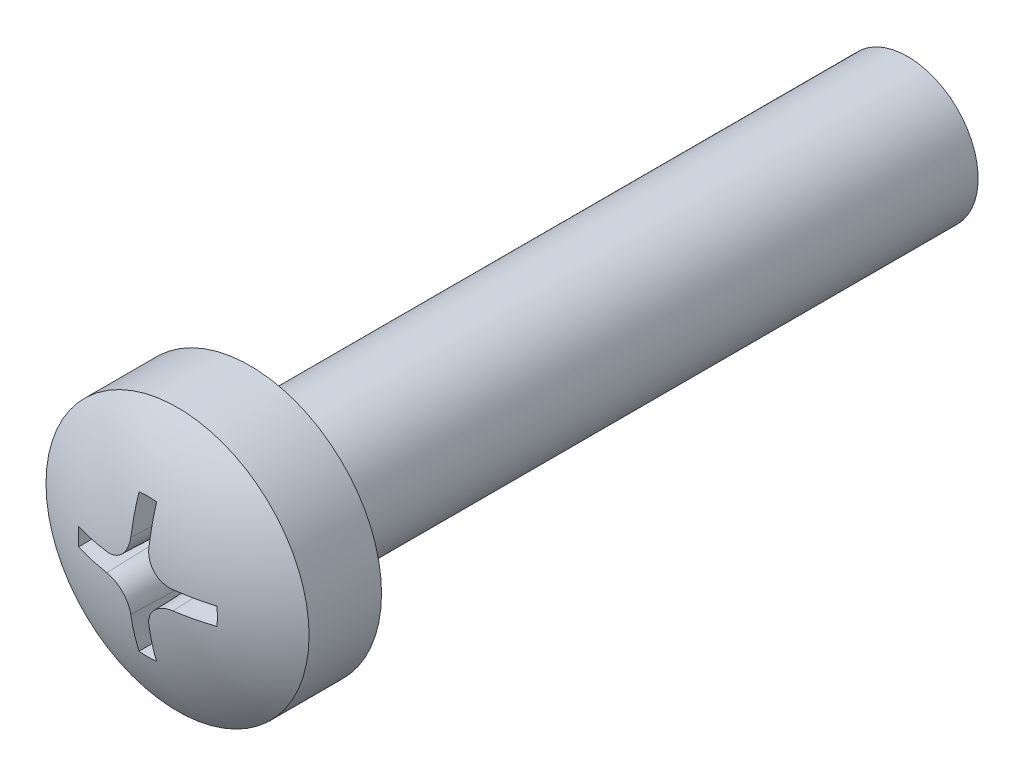
ISO-10303-21;
HEADER;
FILE_DESCRIPTION(('STEP AP214'),'2;1');
FILE_NAME('part.step','',(''),(''),'','','');
FILE_SCHEMA(('AUTOMOTIVE_DESIGN { 1 0 10303 214 1 1 1 1 }'));
ENDSEC;
DATA;
#1=APPLICATION_CONTEXT('core data for automotive mechanical design processes');
#2=APPLICATION_PROTOCOL_DEFINITION('international standard','automotive_design',2000,#1);
#3=PRODUCT_CONTEXT('',#1,'mechanical');
#4=PRODUCT('Part','Part','',(#3));
#5=PRODUCT_RELATED_PRODUCT_CATEGORY('part','',(#4));
#6=PRODUCT_DEFINITION_FORMATION('','',#4);
#7=PRODUCT_DEFINITION_CONTEXT('part definition',#1,'design');
#8=PRODUCT_DEFINITION('design','',#6,#7);
#9=PRODUCT_DEFINITION_SHAPE('','',#8);
#10=(LENGTH_UNIT() NAMED_UNIT(*) SI_UNIT(.MILLI.,.METRE.));
#11=(NAMED_UNIT(*) PLANE_ANGLE_UNIT() SI_UNIT($,.RADIAN.));
#12=(NAMED_UNIT(*) SI_UNIT($,.STERADIAN.) SOLID_ANGLE_UNIT());
#13=UNCERTAINTY_MEASURE_WITH_UNIT(LENGTH_MEASURE(1.E-05),#10,'distance_accuracy_value','');
#14=(GEOMETRIC_REPRESENTATION_CONTEXT(3) GLOBAL_UNCERTAINTY_ASSIGNED_CONTEXT((#13)) GLOBAL_UNIT_ASSIGNED_CONTEXT((#10,
#11,#12)) REPRESENTATION_CONTEXT('',''));
#15=CARTESIAN_POINT('',(0.,0.,0.));
#16=DIRECTION('',(0.,0.,1.));
#17=DIRECTION('',(1.,0.,0.));
#18=AXIS2_PLACEMENT_3D('',#15,#16,#17);
#19=CARTESIAN_POINT('',(0.,0.,14.9000001309199));
#20=DIRECTION('',(0.,0.,1.));
#21=DIRECTION('',(1.,0.,0.));
#22=AXIS2_PLACEMENT_3D('',#19,#20,#21);
#23=PLANE('',#22);
#24=CARTESIAN_POINT('',(0.705000003916211,0.708178557647151,14.9000001309219));
#25=DIRECTION('',(0.,0.,-1.));
#26=DIRECTION('',(-1.,0.,0.));
#27=AXIS2_PLACEMENT_3D('',#24,#25,#26);
#28=CIRCLE('',#27,0.562857384005427);
#29=CARTESIAN_POINT('',(0.142142619912599,0.708178557647151,14.900000130964));
#30=VERTEX_POINT('',#29);
#31=CARTESIAN_POINT('',(0.702712036351556,0.145325823858119,14.9000001309209));
#32=VERTEX_POINT('',#31);
#33=EDGE_CURVE('E216',#30,#32,#28,.F.);
#34=ORIENTED_EDGE('',*,*,#33,.F.);
#35=DIRECTION('',(0.,1.,0.));
#36=VECTOR('',#35,1.);
#37=CARTESIAN_POINT('',(0.142142619910811,1.48592565006124,14.9000001309199));
#38=LINE('',#37,#36);
#39=CARTESIAN_POINT('',(0.142142619910845,1.43009594495776,14.9000001309209));
#40=VERTEX_POINT('',#39);
#41=EDGE_CURVE('E233',#30,#40,#38,.T.);
#42=ORIENTED_EDGE('',*,*,#41,.T.);
#43=CARTESIAN_POINT('',(0.,0.,14.9000001309219));
#44=DIRECTION('',(0.,0.,1.));
#45=DIRECTION('',(1.,0.,0.));
#46=AXIS2_PLACEMENT_3D('',#43,#44,#45);
#47=CIRCLE('',#46,1.43714262903159);
#48=CARTESIAN_POINT('',(-0.142142619910848,1.43009594495776,14.9000001309209));
#49=VERTEX_POINT('',#48);
#50=EDGE_CURVE('E220',#40,#49,#47,.T.);
#51=ORIENTED_EDGE('',*,*,#50,.T.);
#52=DIRECTION('',(0.,1.,0.));
#53=VECTOR('',#52,1.);
#54=CARTESIAN_POINT('',(-0.142142619910814,1.48592565006124,14.9000001309199));
#55=LINE('',#54,#53);
#56=CARTESIAN_POINT('',(-0.142142619910847,0.708178557647151,14.9000001309209));
#57=VERTEX_POINT('',#56);
#58=EDGE_CURVE('E221',#49,#57,#55,.F.);
#59=ORIENTED_EDGE('',*,*,#58,.T.);
#60=CARTESIAN_POINT('',(-0.705000003916212,0.708178557647151,14.9000001309219));
#61=DIRECTION('',(0.,0.,-1.));
#62=DIRECTION('',(-1.,0.,0.));
#63=AXIS2_PLACEMENT_3D('',#60,#61,#62);
#64=CIRCLE('',#63,0.562857384001873);
#65=CARTESIAN_POINT('',(-0.702712036351577,0.145325823859597,14.900000130964));
#66=VERTEX_POINT('',#65);
#67=EDGE_CURVE('E223',#66,#57,#64,.F.);
#68=ORIENTED_EDGE('',*,*,#67,.F.);
#69=DIRECTION('',(-0.99999173819787,-0.00406491525148616,0.));
#70=VECTOR('',#69,1.);
#71=CARTESIAN_POINT('',(-0.702712036351557,0.145325823858086,14.9000001309199));
#72=LINE('',#71,#70);
#73=CARTESIAN_POINT('',(-1.43007341245028,0.142369137079513,14.9000001309209));
#74=VERTEX_POINT('',#73);
#75=EDGE_CURVE('E153',#66,#74,#72,.T.);
#76=ORIENTED_EDGE('',*,*,#75,.T.);
#77=CARTESIAN_POINT('',(0.,0.,14.9000001309219));
#78=DIRECTION('',(0.,0.,1.));
#79=DIRECTION('',(1.,0.,0.));
#80=AXIS2_PLACEMENT_3D('',#77,#78,#79);
#81=CIRCLE('',#80,1.43714262903515);
#82=CARTESIAN_POINT('',(-1.43007341245029,-0.142369137079519,14.9000001309211));
#83=VERTEX_POINT('',#82);
#84=EDGE_CURVE('E149',#74,#83,#81,.T.);
#85=ORIENTED_EDGE('',*,*,#84,.T.);
#86=DIRECTION('',(0.99999173819787,-0.00406491525148616,0.));
#87=VECTOR('',#86,1.);
#88=CARTESIAN_POINT('',(-1.43007341244828,-0.142369137079487,14.9000001309199));
#89=LINE('',#88,#87);
#90=CARTESIAN_POINT('',(-0.702712036351557,-0.14532582385812,14.9000001309209));
#91=VERTEX_POINT('',#90);
#92=EDGE_CURVE('E161',#83,#91,#89,.T.);
#93=ORIENTED_EDGE('',*,*,#92,.T.);
#94=CARTESIAN_POINT('',(-0.705000003916213,-0.708178557647151,14.9000001309219));
#95=DIRECTION('',(0.,0.,-1.));
#96=DIRECTION('',(-1.,0.,0.));
#97=AXIS2_PLACEMENT_3D('',#94,#95,#96);
#98=CIRCLE('',#97,0.562857384001873);
#99=CARTESIAN_POINT('',(-0.142142619913489,-0.708178557647151,14.900000130964));
#100=VERTEX_POINT('',#99);
#101=EDGE_CURVE('E198',#100,#91,#98,.F.);
#102=ORIENTED_EDGE('',*,*,#101,.F.);
#103=DIRECTION('',(0.,1.,0.));
#104=VECTOR('',#103,1.);
#105=CARTESIAN_POINT('',(-0.142142619910814,-1.48592565006124,14.9000001309199));
#106=LINE('',#105,#104);
#107=CARTESIAN_POINT('',(-0.142142619910848,-1.43009594495776,14.9000001309209));
#108=VERTEX_POINT('',#107);
#109=EDGE_CURVE('E225',#100,#108,#106,.F.);
#110=ORIENTED_EDGE('',*,*,#109,.T.);
#111=CARTESIAN_POINT('',(0.,0.,14.9000001309219));
#112=DIRECTION('',(0.,0.,1.));
#113=DIRECTION('',(1.,0.,0.));
#114=AXIS2_PLACEMENT_3D('',#111,#112,#113);
#115=CIRCLE('',#114,1.43714262903159);
#116=CARTESIAN_POINT('',(0.142142619910845,-1.43009594495776,14.9000001309209));
#117=VERTEX_POINT('',#116);
#118=EDGE_CURVE('E202',#108,#117,#115,.T.);
#119=ORIENTED_EDGE('',*,*,#118,.T.);
#120=DIRECTION('',(0.,1.,0.));
#121=VECTOR('',#120,1.);
#122=CARTESIAN_POINT('',(0.142142619910811,-1.48592565006124,14.9000001309199));
#123=LINE('',#122,#121);
#124=CARTESIAN_POINT('',(0.142142619910845,-0.708178557647152,14.9000001309209));
#125=VERTEX_POINT('',#124);
#126=EDGE_CURVE('E203',#117,#125,#123,.T.);
#127=ORIENTED_EDGE('',*,*,#126,.T.);
#128=CARTESIAN_POINT('',(0.705000003916211,-0.708178557647152,14.9000001309219));
#129=DIRECTION('',(0.,0.,-1.));
#130=DIRECTION('',(-1.,0.,0.));
#131=AXIS2_PLACEMENT_3D('',#128,#129,#130);
#132=CIRCLE('',#131,0.562857384004204);
#133=CARTESIAN_POINT('',(0.702712036351568,-0.145325823856932,14.900000130964));
#134=VERTEX_POINT('',#133);
#135=EDGE_CURVE('E207',#134,#125,#132,.F.);
#136=ORIENTED_EDGE('',*,*,#135,.F.);
#137=DIRECTION('',(0.99999173819787,0.00406491525148593,0.));
#138=VECTOR('',#137,1.);
#139=CARTESIAN_POINT('',(0.702712036351555,-0.145325823858086,14.9000001309199));
#140=LINE('',#139,#138);
#141=CARTESIAN_POINT('',(1.43007341244671,-0.142369137079528,14.9000001309209));
#142=VERTEX_POINT('',#141);
#143=EDGE_CURVE('E229',#134,#142,#140,.T.);
#144=ORIENTED_EDGE('',*,*,#143,.T.);
#145=CARTESIAN_POINT('',(0.,0.,14.9000001309219));
#146=DIRECTION('',(0.,0.,1.));
#147=DIRECTION('',(1.,0.,0.));
#148=AXIS2_PLACEMENT_3D('',#145,#146,#147);
#149=CIRCLE('',#148,1.43714262903159);
#150=CARTESIAN_POINT('',(1.43007341244671,0.142369137079528,14.9000001309209));
#151=VERTEX_POINT('',#150);
#152=EDGE_CURVE('E231',#142,#151,#149,.T.);
#153=ORIENTED_EDGE('',*,*,#152,.T.);
#154=DIRECTION('',(-0.999991738197871,0.00406491525148496,0.));
#155=VECTOR('',#154,1.);
#156=CARTESIAN_POINT('',(1.43007341244828,0.142369137079488,14.9000001309199));
#157=LINE('',#156,#155);
#158=EDGE_CURVE('E212',#151,#32,#157,.T.);
#159=ORIENTED_EDGE('',*,*,#158,.T.);
#160=EDGE_LOOP('',(#34,#42,#51,#59,#68,#76,#85,#93,#102,#110,#119,#127,#136,#144,#153,#159));
#161=FACE_BOUND('',#160,.T.);
#162=ADVANCED_FACE('F17',(#161),#23,.T.);
#163=CARTESIAN_POINT('',(-1.48592565006124,0.205000003916213,16.7000001));
#164=DIRECTION('',(-0.00406243901494529,0.999382570249833,-0.034899496702501));
#165=DIRECTION('',(0.,0.0348997846864301,0.999390816962434));
#166=AXIS2_PLACEMENT_3D('',#163,#164,#165);
#167=PLANE('',#166);
#168=ORIENTED_EDGE('',*,*,#75,.F.);
#169=DIRECTION('',(-0.000141863496415189,0.0348992083697649,0.999390827019096));
#170=VECTOR('',#169,1.);
#171=CARTESIAN_POINT('',(70.132437300017,-17425.6949999941,-499000.));
#172=LINE('',#171,#170);
#173=CARTESIAN_POINT('',(-0.702917362550793,0.195837210338992,16.3464689382796));
#174=VERTEX_POINT('',#173);
#175=EDGE_CURVE('E152',#174,#66,#172,.F.);
#176=ORIENTED_EDGE('',*,*,#175,.F.);
#177=CARTESIAN_POINT('',(-1.46986565043211,0.186746338396848,16.1754183821501));
#178=CARTESIAN_POINT('',(-1.34428752940993,0.18860348241013,16.2139818007153));
#179=CARTESIAN_POINT('',(-1.21758611157519,0.190289627078315,16.2475177230015));
#180=CARTESIAN_POINT('',(-0.961936682280607,0.19331991772449,16.3045345750159));
#181=CARTESIAN_POINT('',(-0.832988670820762,0.194664063702481,16.3280155047441));
#182=CARTESIAN_POINT('',(-0.702917362548362,0.195837210335374,16.3464689381933));
#183=B_SPLINE_CURVE_WITH_KNOTS('',3,(#177,#178,#179,#180,#181,#182),.UNSPECIFIED.,.F.,.F.,(4,2,
4),(0.,0.393226085145473,0.786452170290946),.UNSPECIFIED.);
#184=CARTESIAN_POINT('',(-1.46986565043198,0.186746338396842,16.1754183821499));
#185=VERTEX_POINT('',#184);
#186=EDGE_CURVE('E138',#185,#174,#183,.T.);
#187=ORIENTED_EDGE('',*,*,#186,.F.);
#188=CARTESIAN_POINT('',(-1.43007341245026,0.142369137079491,14.9000001309203));
#189=CARTESIAN_POINT('',(-1.43679558084178,0.149764873302674,15.1125670437899));
#190=CARTESIAN_POINT('',(-1.44347268487158,0.157160841526578,15.3251353545666));
#191=CARTESIAN_POINT('',(-1.45673676419865,0.171953241965694,15.750274771643));
#192=CARTESIAN_POINT('',(-1.46332373949605,0.179349674180905,15.9628458779428));
#193=CARTESIAN_POINT('',(-1.46986565043185,0.186746338396836,16.1754183821497));
#194=B_SPLINE_CURVE_WITH_KNOTS('',3,(#188,#189,#190,#191,#192,#193),.UNSPECIFIED.,.F.,.F.,(4,2,
4),(0.,0.638405151370182,1.2768103018657),.UNSPECIFIED.);
#195=EDGE_CURVE('E20',#74,#185,#194,.T.);
#196=ORIENTED_EDGE('',*,*,#195,.F.);
#197=EDGE_LOOP('',(#168,#176,#187,#196));
#198=FACE_BOUND('',#197,.T.);
#199=ADVANCED_FACE('F154',(#198),#167,.F.);
#200=CARTESIAN_POINT('',(-0.705000003916212,0.708178557647151,14.9000001310924));
#201=DIRECTION('',(0.,0.,-1.));
#202=DIRECTION('',(-1.,0.,0.));
#203=AXIS2_PLACEMENT_3D('',#200,#201,#202);
#204=CONICAL_SURFACE('',#203,0.562857383995918,0.0349065850381506);
#205=ORIENTED_EDGE('',*,*,#67,.T.);
#206=DIRECTION('',(-0.0348994967025011,0.,0.999390827019096));
#207=VECTOR('',#206,1.);
#208=CARTESIAN_POINT('',(-0.205000003916212,0.708178557647151,16.7000001));
#209=LINE('',#208,#207);
#210=CARTESIAN_POINT('',(-0.19263261070433,0.708178557647152,16.3458442955351));
#211=VERTEX_POINT('',#210);
#212=EDGE_CURVE('E218',#57,#211,#209,.T.);
#213=ORIENTED_EDGE('',*,*,#212,.T.);
#214=CARTESIAN_POINT('',(-0.702917362548364,0.195837210336319,16.3464689381933));
#215=CARTESIAN_POINT('',(-0.67436980018715,0.196069022046819,16.3505190975805));
#216=CARTESIAN_POINT('',(-0.645793507197431,0.19872503762619,16.3542201634549));
#217=CARTESIAN_POINT('',(-0.58939226596063,0.208746632583552,16.3608331853193));
#218=CARTESIAN_POINT('',(-0.561567142953422,0.216111106521399,16.3637453263028));
#219=CARTESIAN_POINT('',(-0.507438053942326,0.235419873788284,16.3686938321558));
#220=CARTESIAN_POINT('',(-0.481135508231764,0.247368366411791,16.3707293903722));
#221=CARTESIAN_POINT('',(-0.430863603562778,0.2755158207477,16.373859576632));
#222=CARTESIAN_POINT('',(-0.406893324169671,0.291713096263242,16.3749545772154));
#223=CARTESIAN_POINT('',(-0.362233377453729,0.327703731581279,16.3761643038353));
#224=CARTESIAN_POINT('',(-0.341510466992254,0.347455493012148,16.3762897001293));
#225=CARTESIAN_POINT('',(-0.303626282104826,0.390106685464143,16.375584525499));
#226=CARTESIAN_POINT('',(-0.286464927046616,0.413006045205327,16.3747539762197));
#227=CARTESIAN_POINT('',(-0.256249858583962,0.461180936796083,16.3721680487287));
#228=CARTESIAN_POINT('',(-0.243178703286462,0.486445765073049,16.3704166853158));
#229=CARTESIAN_POINT('',(-0.221388409499955,0.538712861485288,16.3660428028671));
#230=CARTESIAN_POINT('',(-0.212667643785515,0.565714475718045,16.3634206101697));
#231=CARTESIAN_POINT('',(-0.201794694683799,0.612078170131444,16.3583284039337));
#232=CARTESIAN_POINT('',(-0.198441522019643,0.63119118591535,16.3560668342543));
#233=CARTESIAN_POINT('',(-0.193908806228678,0.669599335889634,16.3512034858604));
#234=CARTESIAN_POINT('',(-0.192725812129162,0.688894131812637,16.3486022543384));
#235=CARTESIAN_POINT('',(-0.192632610705273,0.708178557647152,16.3458442955351));
#236=B_SPLINE_CURVE_WITH_KNOTS('',3,(#214,#215,#216,#217,#218,#219,#220,#221,#222,#223,#224,
#225,#226,#227,#228,#229,#230,#231,#232,#233,#234,#235),.UNSPECIFIED.,.F.,.F.,(4,2,2,2,2,2,2,2,
2,2,4),(0.,0.0864031866709967,0.172786095262079,0.259248326565269,0.345676295739736,
0.431151773616245,0.516625316149333,0.601729242674347,0.686801312902123,0.745292576512741,
0.803690747641269),.UNSPECIFIED.);
#237=EDGE_CURVE('E157',#174,#211,#236,.T.);
#238=ORIENTED_EDGE('',*,*,#237,.F.);
#239=ORIENTED_EDGE('',*,*,#175,.T.);
#240=EDGE_LOOP('',(#205,#213,#238,#239));
#241=FACE_BOUND('',#240,.T.);
#242=ADVANCED_FACE('F382',(#241),#204,.T.);
#243=CARTESIAN_POINT('',(-0.205000003916213,1.48592565006124,16.7000001));
#244=DIRECTION('',(-0.999390827019096,0.,-0.0348994967025011));
#245=DIRECTION('',(-0.0348994967025011,0.,0.999390827019096));
#246=AXIS2_PLACEMENT_3D('',#243,#244,#245);
#247=PLANE('',#246);
#248=ORIENTED_EDGE('',*,*,#212,.F.);
#249=ORIENTED_EDGE('',*,*,#58,.F.);
#250=CARTESIAN_POINT('',(-0.142142619910856,1.43009594495777,14.9000001309211));
#251=CARTESIAN_POINT('',(-0.149565618889119,1.43681645267134,15.1125670097815));
#252=CARTESIAN_POINT('',(-0.156988667277224,1.4434915381129,15.3251353035546));
#253=CARTESIAN_POINT('',(-0.171834862862787,1.45675086444271,15.7502747206305));
#254=CARTESIAN_POINT('',(-0.179258010060243,1.46333510533111,15.9628458439332));
#255=CARTESIAN_POINT('',(-0.186681206667541,1.4698739239476,16.1754183821487));
#256=B_SPLINE_CURVE_WITH_KNOTS('',3,(#250,#251,#252,#253,#254,#255),.UNSPECIFIED.,.F.,.F.,(4,2,
4),(0.,0.638407739125836,1.27681547736308),.UNSPECIFIED.);
#257=CARTESIAN_POINT('',(-0.186681206667516,1.46987392394758,16.1754183821479));
#258=VERTEX_POINT('',#257);
#259=EDGE_CURVE('E235',#49,#258,#256,.T.);
#260=ORIENTED_EDGE('',*,*,#259,.T.);
#261=CARTESIAN_POINT('',(-0.19263261070433,0.708178557647152,16.3458442955351));
#262=CARTESIAN_POINT('',(-0.191987061578843,0.837349646568903,16.3273581872711));
#263=CARTESIAN_POINT('',(-0.191168336679704,0.965409804888191,16.3039129736903));
#264=CARTESIAN_POINT('',(-0.189184535334124,1.21930826032184,16.2471043358953));
#265=CARTESIAN_POINT('',(-0.188019458887683,1.34514655743621,16.2137409116811));
#266=CARTESIAN_POINT('',(-0.186681206667591,1.46987392394811,16.1754183821501));
#267=B_SPLINE_CURVE_WITH_KNOTS('',3,(#261,#262,#263,#264,#265,#266),.UNSPECIFIED.,.F.,.F.,(4,2,
4),(0.,0.390573645413542,0.781147290827086),.UNSPECIFIED.);
#268=EDGE_CURVE('E159',#211,#258,#267,.T.);
#269=ORIENTED_EDGE('',*,*,#268,.F.);
#270=EDGE_LOOP('',(#248,#249,#260,#269));
#271=FACE_BOUND('',#270,.T.);
#272=ADVANCED_FACE('F379',(#271),#247,.F.);
#273=CARTESIAN_POINT('',(0.,0.,16.1754183821472));
#274=DIRECTION('',(0.,0.,1.));
#275=DIRECTION('',(1.,0.,0.));
#276=AXIS2_PLACEMENT_3D('',#273,#274,#275);
#277=CONICAL_SURFACE('',#276,1.48168121578962,0.0349065850409978);
#278=ORIENTED_EDGE('',*,*,#259,.F.);
#279=ORIENTED_EDGE('',*,*,#50,.F.);
#280=CARTESIAN_POINT('',(0.142142619910826,1.43009594495774,14.9000001309203));
#281=CARTESIAN_POINT('',(0.1495656188891,1.43681645267133,15.112567009781));
#282=CARTESIAN_POINT('',(0.156988667277216,1.44349153811289,15.3251353035544));
#283=CARTESIAN_POINT('',(0.171834862862798,1.45675086444273,15.7502747206309));
#284=CARTESIAN_POINT('',(0.179258010060265,1.46333510533113,15.9628458439339));
#285=CARTESIAN_POINT('',(0.186681206667573,1.46987392394763,16.1754183821497));
#286=B_SPLINE_CURVE_WITH_KNOTS('',3,(#280,#281,#282,#283,#284,#285),.UNSPECIFIED.,.F.,.F.,(4,2,
4),(0.,0.638407739126717,1.27681547736484),.UNSPECIFIED.);
#287=CARTESIAN_POINT('',(0.186681206667581,1.46987392394776,16.1754183821499));
#288=VERTEX_POINT('',#287);
#289=EDGE_CURVE('E217',#40,#288,#286,.T.);
#290=ORIENTED_EDGE('',*,*,#289,.T.);
#291=CARTESIAN_POINT('',(0.,0.,16.1754183821472));
#292=DIRECTION('',(0.,0.,1.));
#293=DIRECTION('',(1.,0.,0.));
#294=AXIS2_PLACEMENT_3D('',#291,#292,#293);
#295=CIRCLE('',#294,1.48168121578962);
#296=EDGE_CURVE('E361',#258,#288,#295,.F.);
#297=ORIENTED_EDGE('',*,*,#296,.F.);
#298=EDGE_LOOP('',(#278,#279,#290,#297));
#299=FACE_BOUND('',#298,.T.);
#300=ADVANCED_FACE('F366',(#299),#277,.F.);
#301=CARTESIAN_POINT('',(0.205000003916211,1.48592565006124,16.7000001));
#302=DIRECTION('',(0.999390827019096,0.,-0.0348994967025011));
#303=DIRECTION('',(-0.0348994967025011,0.,-0.999390827019096));
#304=AXIS2_PLACEMENT_3D('',#301,#302,#303);
#305=PLANE('',#304);
#306=ORIENTED_EDGE('',*,*,#41,.F.);
#307=DIRECTION('',(0.0348994967025011,0.,0.999390827019096));
#308=VECTOR('',#307,1.);
#309=CARTESIAN_POINT('',(-17425.8421532322,0.708178557645017,-499000.));
#310=LINE('',#309,#308);
#311=CARTESIAN_POINT('',(0.192632610708125,0.708178557644845,16.3458442956176));
#312=VERTEX_POINT('',#311);
#313=EDGE_CURVE('E213',#312,#30,#310,.F.);
#314=ORIENTED_EDGE('',*,*,#313,.F.);
#315=CARTESIAN_POINT('',(0.186681206667589,1.46987392394789,16.1754183821501));
#316=CARTESIAN_POINT('',(0.18801945888769,1.34514655743528,16.2137409116813));
#317=CARTESIAN_POINT('',(0.189184535334137,1.21930826032019,16.2471043358957));
#318=CARTESIAN_POINT('',(0.191168336679724,0.965409804885074,16.303912973691));
#319=CARTESIAN_POINT('',(0.191987061578865,0.837349646565043,16.3273581872718));
#320=CARTESIAN_POINT('',(0.192632610704352,0.70817855764254,16.3458442955358));
#321=B_SPLINE_CURVE_WITH_KNOTS('',3,(#315,#316,#317,#318,#319,#320),.UNSPECIFIED.,.F.,.F.,(4,2,
4),(0.,0.390573645415759,0.781147290831516),.UNSPECIFIED.);
#322=EDGE_CURVE('E355',#288,#312,#321,.T.);
#323=ORIENTED_EDGE('',*,*,#322,.F.);
#324=ORIENTED_EDGE('',*,*,#289,.F.);
#325=EDGE_LOOP('',(#306,#314,#323,#324));
#326=FACE_BOUND('',#325,.T.);
#327=ADVANCED_FACE('F362',(#326),#305,.F.);
#328=CARTESIAN_POINT('',(0.705000003916211,0.708178557647151,14.9000001310924));
#329=DIRECTION('',(0.,0.,-1.));
#330=DIRECTION('',(-1.,0.,0.));
#331=AXIS2_PLACEMENT_3D('',#328,#329,#330);
#332=CONICAL_SURFACE('',#331,0.562857383999472,0.034906585039571);
#333=DIRECTION('',(0.000141863496415092,0.0348992083697649,0.999390827019096));
#334=VECTOR('',#333,1.);
#335=CARTESIAN_POINT('',(0.702712036351556,0.145325823858085,14.9000001309199));
#336=LINE('',#335,#334);
#337=CARTESIAN_POINT('',(0.702917362553185,0.19583721033533,16.3464689381926));
#338=VERTEX_POINT('',#337);
#339=EDGE_CURVE('E209',#32,#338,#336,.T.);
#340=ORIENTED_EDGE('',*,*,#339,.T.);
#341=CARTESIAN_POINT('',(0.192632610703799,0.708178557642539,16.3458442955358));
#342=CARTESIAN_POINT('',(0.19274968681593,0.679623136431122,16.349931080972));
#343=CARTESIAN_POINT('',(0.195291961232022,0.651029128806695,16.3536714829263));
#344=CARTESIAN_POINT('',(0.205091671713062,0.594573253475984,16.3603674324906));
#345=CARTESIAN_POINT('',(0.212348049264682,0.566711222871146,16.3633231560838));
#346=CARTESIAN_POINT('',(0.231449704920128,0.512490093032576,16.3683618996591));
#347=CARTESIAN_POINT('',(0.243299207268657,0.486132402998755,16.3704441126019));
#348=CARTESIAN_POINT('',(0.271261342516732,0.435734142015784,16.3736691957498));
#349=CARTESIAN_POINT('',(0.28737227127629,0.41169265005278,16.3748124406987));
#350=CARTESIAN_POINT('',(0.323203760939119,0.366881448807058,16.3761181368379));
#351=CARTESIAN_POINT('',(0.342881940172549,0.346078157568706,16.3762914133503));
#352=CARTESIAN_POINT('',(0.385402404347429,0.308022364292678,16.3756809748648));
#353=CARTESIAN_POINT('',(0.408244608879423,0.290769772046442,16.3748972841828));
#354=CARTESIAN_POINT('',(0.456315848197497,0.260370145875393,16.372402851913));
#355=CARTESIAN_POINT('',(0.481533329488926,0.247204453614228,16.3706964239748));
#356=CARTESIAN_POINT('',(0.533723112960379,0.225218896203565,16.3664093169895));
#357=CARTESIAN_POINT('',(0.560694746397848,0.2163973857712,16.3638289695501));
#358=CARTESIAN_POINT('',(0.606992952744759,0.2053592385016,16.3588070393871));
#359=CARTESIAN_POINT('',(0.626065109003504,0.201938935740314,16.356575605808));
#360=CARTESIAN_POINT('',(0.664399504522591,0.197264900355412,16.3517712460391));
#361=CARTESIAN_POINT('',(0.683661392929335,0.19600772804792,16.3491988690272));
#362=CARTESIAN_POINT('',(0.702917362553184,0.195837210334776,16.3464689381926));
#363=B_SPLINE_CURVE_WITH_KNOTS('',3,(#341,#342,#343,#344,#345,#346,#347,#348,#349,#350,#351,
#352,#353,#354,#355,#356,#357,#358,#359,#360,#361,#362),.UNSPECIFIED.,.F.,.F.,(4,2,2,2,2,2,2,2,
2,2,4),(0.,0.0864400271991004,0.172860651702031,0.25936094557447,0.34582670023042,
0.431325501185146,0.516822129701098,0.601922487522613,0.686990590237349,0.745386994260038,
0.803690453614609),.UNSPECIFIED.);
#364=EDGE_CURVE('E349',#312,#338,#363,.T.);
#365=ORIENTED_EDGE('',*,*,#364,.F.);
#366=ORIENTED_EDGE('',*,*,#313,.T.);
#367=ORIENTED_EDGE('',*,*,#33,.T.);
#368=EDGE_LOOP('',(#340,#365,#366,#367));
#369=FACE_BOUND('',#368,.T.);
#370=ADVANCED_FACE('F337',(#369),#332,.T.);
#371=CARTESIAN_POINT('',(1.48592565006123,0.205000003916213,16.7000001));
#372=DIRECTION('',(0.00406243901494415,0.999382570249833,-0.034899496702501));
#373=DIRECTION('',(0.,0.0348997846864301,0.999390816962434));
#374=AXIS2_PLACEMENT_3D('',#371,#372,#373);
#375=PLANE('',#374);
#376=ORIENTED_EDGE('',*,*,#339,.F.);
#377=ORIENTED_EDGE('',*,*,#158,.F.);
#378=CARTESIAN_POINT('',(1.43007341244672,0.142369137079536,14.9000001309211));
#379=CARTESIAN_POINT('',(1.43679558083882,0.149764873302706,15.1125670437904));
#380=CARTESIAN_POINT('',(1.4434726848692,0.157160841526597,15.3251353545668));
#381=CARTESIAN_POINT('',(1.45673676419744,0.171953241965686,15.7502747716427));
#382=CARTESIAN_POINT('',(1.46332373949543,0.179349674180884,15.9628458779421));
#383=CARTESIAN_POINT('',(1.46986565043182,0.186746338396802,16.1754183821487));
#384=B_SPLINE_CURVE_WITH_KNOTS('',3,(#378,#379,#380,#381,#382,#383),.UNSPECIFIED.,.F.,.F.,(4,2,
4),(0.,0.638405151369315,1.27681030186397),.UNSPECIFIED.);
#385=CARTESIAN_POINT('',(1.46986565043179,0.186746338396776,16.1754183821479));
#386=VERTEX_POINT('',#385);
#387=EDGE_CURVE('E211',#151,#386,#384,.T.);
#388=ORIENTED_EDGE('',*,*,#387,.T.);
#389=CARTESIAN_POINT('',(0.702917362553185,0.195837210335329,16.3464689381926));
#390=CARTESIAN_POINT('',(0.832988670824794,0.194664063702439,16.3280155047434));
#391=CARTESIAN_POINT('',(0.961936682283861,0.193319917724453,16.3045345750152));
#392=CARTESIAN_POINT('',(1.21758611157691,0.190289627078292,16.247517723001));
#393=CARTESIAN_POINT('',(1.34428752941089,0.188603482410116,16.213981800715));
#394=CARTESIAN_POINT('',(1.46986565043232,0.186746338396845,16.1754183821501));
#395=B_SPLINE_CURVE_WITH_KNOTS('',3,(#389,#390,#391,#392,#393,#394),.UNSPECIFIED.,.F.,.F.,(4,2,
4),(0.,0.393226085143152,0.786452170286303),.UNSPECIFIED.);
#396=EDGE_CURVE('E144',#338,#386,#395,.T.);
#397=ORIENTED_EDGE('',*,*,#396,.F.);
#398=EDGE_LOOP('',(#376,#377,#388,#397));
#399=FACE_BOUND('',#398,.T.);
#400=ADVANCED_FACE('F333',(#399),#375,.F.);
#401=CARTESIAN_POINT('',(0.,0.,16.1754183821472));
#402=DIRECTION('',(0.,0.,1.));
#403=DIRECTION('',(1.,0.,0.));
#404=AXIS2_PLACEMENT_3D('',#401,#402,#403);
#405=CONICAL_SURFACE('',#404,1.48168121578962,0.0349065850382157);
#406=ORIENTED_EDGE('',*,*,#84,.F.);
#407=ORIENTED_EDGE('',*,*,#195,.T.);
#408=CARTESIAN_POINT('',(0.,0.,16.1754183821472));
#409=DIRECTION('',(0.,0.,1.));
#410=DIRECTION('',(1.,0.,0.));
#411=AXIS2_PLACEMENT_3D('',#408,#409,#410);
#412=CIRCLE('',#411,1.48168121578962);
#413=CARTESIAN_POINT('',(-1.46986565043181,-0.186746338396793,16.1754183821484));
#414=VERTEX_POINT('',#413);
#415=EDGE_CURVE('E132',#414,#185,#412,.F.);
#416=ORIENTED_EDGE('',*,*,#415,.F.);
#417=CARTESIAN_POINT('',(-1.46986565043185,-0.186746338396836,16.1754183821497));
#418=CARTESIAN_POINT('',(-1.46332373949605,-0.179349674180905,15.9628458779428));
#419=CARTESIAN_POINT('',(-1.45673676419865,-0.171953241965694,15.7502747716431));
#420=CARTESIAN_POINT('',(-1.44347268487158,-0.157160841526578,15.3251353545666));
#421=CARTESIAN_POINT('',(-1.43679558084178,-0.149764873302675,15.1125670437899));
#422=CARTESIAN_POINT('',(-1.43007341245026,-0.142369137079491,14.9000001309203));
#423=B_SPLINE_CURVE_WITH_KNOTS('',3,(#417,#418,#419,#420,#421,#422),.UNSPECIFIED.,.F.,.F.,(4,2,
4),(0.,0.638405150495528,1.27681030186572),.UNSPECIFIED.);
#424=EDGE_CURVE('E173',#414,#83,#423,.T.);
#425=ORIENTED_EDGE('',*,*,#424,.T.);
#426=EDGE_LOOP('',(#406,#407,#416,#425));
#427=FACE_BOUND('',#426,.T.);
#428=ADVANCED_FACE('F148',(#427),#405,.F.);
#429=CARTESIAN_POINT('',(0.,0.,16.1754183821472));
#430=DIRECTION('',(0.,0.,1.));
#431=DIRECTION('',(1.,0.,0.));
#432=AXIS2_PLACEMENT_3D('',#429,#430,#431);
#433=CONICAL_SURFACE('',#432,1.48168121578962,0.0349065850409978);
#434=ORIENTED_EDGE('',*,*,#152,.F.);
#435=CARTESIAN_POINT('',(1.43007341244669,-0.142369137079509,14.9000001309203));
#436=CARTESIAN_POINT('',(1.4367955808388,-0.149764873302689,15.1125670437899));
#437=CARTESIAN_POINT('',(1.44347268486919,-0.15716084152659,15.3251353545666));
#438=CARTESIAN_POINT('',(1.45673676419746,-0.1719532419657,15.7502747716431));
#439=CARTESIAN_POINT('',(1.46332373949545,-0.179349674180908,15.9628458779428));
#440=CARTESIAN_POINT('',(1.46986565043185,-0.186746338396836,16.1754183821497));
#441=B_SPLINE_CURVE_WITH_KNOTS('',3,(#435,#436,#437,#438,#439,#440),.UNSPECIFIED.,.F.,.F.,(4,2,
4),(0.,0.638405151370194,1.27681030186573),.UNSPECIFIED.);
#442=CARTESIAN_POINT('',(1.46986565043198,-0.186746338396843,16.1754183821499));
#443=VERTEX_POINT('',#442);
#444=EDGE_CURVE('E208',#142,#443,#441,.T.);
#445=ORIENTED_EDGE('',*,*,#444,.T.);
#446=CARTESIAN_POINT('',(0.,0.,16.1754183821472));
#447=DIRECTION('',(0.,0.,1.));
#448=DIRECTION('',(1.,0.,0.));
#449=AXIS2_PLACEMENT_3D('',#446,#447,#448);
#450=CIRCLE('',#449,1.48168121578962);
#451=EDGE_CURVE('E143',#386,#443,#450,.F.);
#452=ORIENTED_EDGE('',*,*,#451,.F.);
#453=ORIENTED_EDGE('',*,*,#387,.F.);
#454=EDGE_LOOP('',(#434,#445,#452,#453));
#455=FACE_BOUND('',#454,.T.);
#456=ADVANCED_FACE('F315',(#455),#433,.F.);
#457=CARTESIAN_POINT('',(1.48592565006123,-0.205000003916213,16.7000001));
#458=DIRECTION('',(0.00406243901494512,-0.999382570249833,-0.034899496702501));
#459=DIRECTION('',(0.,0.0348997846864301,-0.999390816962434));
#460=AXIS2_PLACEMENT_3D('',#457,#458,#459);
#461=PLANE('',#460);
#462=ORIENTED_EDGE('',*,*,#143,.F.);
#463=DIRECTION('',(0.000141863496415193,-0.0348992083697649,0.999390827019096));
#464=VECTOR('',#463,1.);
#465=CARTESIAN_POINT('',(-70.1324373000188,17425.6949999941,-499000.));
#466=LINE('',#465,#464);
#467=CARTESIAN_POINT('',(0.702917362550783,-0.195837210336051,16.3464689382796));
#468=VERTEX_POINT('',#467);
#469=EDGE_CURVE('E204',#468,#134,#466,.F.);
#470=ORIENTED_EDGE('',*,*,#469,.F.);
#471=CARTESIAN_POINT('',(1.46986565043211,-0.186746338396851,16.1754183821501));
#472=CARTESIAN_POINT('',(1.34428752940992,-0.188603482410132,16.2139818007153));
#473=CARTESIAN_POINT('',(1.21758611157519,-0.190289627078315,16.2475177230015));
#474=CARTESIAN_POINT('',(0.961936682280607,-0.19331991772449,16.3045345750159));
#475=CARTESIAN_POINT('',(0.832988670820763,-0.19466406370248,16.3280155047441));
#476=CARTESIAN_POINT('',(0.702917362548364,-0.195837210335374,16.3464689381933));
#477=B_SPLINE_CURVE_WITH_KNOTS('',3,(#471,#472,#473,#474,#475,#476),.UNSPECIFIED.,.F.,.F.,(4,2,
4),(0.,0.393226085145472,0.786452170290944),.UNSPECIFIED.);
#478=EDGE_CURVE('E305',#443,#468,#477,.T.);
#479=ORIENTED_EDGE('',*,*,#478,.F.);
#480=ORIENTED_EDGE('',*,*,#444,.F.);
#481=EDGE_LOOP('',(#462,#470,#479,#480));
#482=FACE_BOUND('',#481,.T.);
#483=ADVANCED_FACE('F311',(#482),#461,.F.);
#484=CARTESIAN_POINT('',(0.705000003916211,-0.708178557647152,14.9000001310924));
#485=DIRECTION('',(0.,0.,-1.));
#486=DIRECTION('',(-1.,0.,0.));
#487=AXIS2_PLACEMENT_3D('',#484,#485,#486);
#488=CONICAL_SURFACE('',#487,0.562857383998249,0.0349065850381506);
#489=ORIENTED_EDGE('',*,*,#135,.T.);
#490=DIRECTION('',(-0.0348994967025011,0.,-0.999390827019096));
#491=VECTOR('',#490,1.);
#492=CARTESIAN_POINT('',(0.205000003916211,-0.708178557647152,16.7000001));
#493=LINE('',#492,#491);
#494=CARTESIAN_POINT('',(0.192632610704328,-0.708178557647152,16.3458442955351));
#495=VERTEX_POINT('',#494);
#496=EDGE_CURVE('E200',#125,#495,#493,.F.);
#497=ORIENTED_EDGE('',*,*,#496,.T.);
#498=CARTESIAN_POINT('',(0.702917362548358,-0.19583721033399,16.3464689381933));
#499=CARTESIAN_POINT('',(0.674369800187014,-0.196069022044491,16.3505190975806));
#500=CARTESIAN_POINT('',(0.645793507197166,-0.198725037623874,16.354220163455));
#501=CARTESIAN_POINT('',(0.589392265960108,-0.208746632581284,16.3608331853195));
#502=CARTESIAN_POINT('',(0.561567142952774,-0.216111106519164,16.3637453263029));
#503=CARTESIAN_POINT('',(0.507438053941431,-0.235419873786137,16.368693832156));
#504=CARTESIAN_POINT('',(0.481135508230749,-0.247368366409696,16.3707293903724));
#505=CARTESIAN_POINT('',(0.430863603561534,-0.275515820745733,16.3738595766322));
#506=CARTESIAN_POINT('',(0.406893324168319,-0.291713096261349,16.3749545772156));
#507=CARTESIAN_POINT('',(0.362233377452173,-0.327703731579549,16.3761643038355));
#508=CARTESIAN_POINT('',(0.341510466990603,-0.347455493010507,16.3762897001295));
#509=CARTESIAN_POINT('',(0.303626282103003,-0.390106685462696,16.3755845254992));
#510=CARTESIAN_POINT('',(0.286464927044716,-0.413006045203984,16.3747539762199));
#511=CARTESIAN_POINT('',(0.256249858581924,-0.461180936794959,16.3721680487289));
#512=CARTESIAN_POINT('',(0.243178703284364,-0.486445765072039,16.370416685316));
#513=CARTESIAN_POINT('',(0.221388409497758,-0.538712861484514,16.3660428028673));
#514=CARTESIAN_POINT('',(0.212667643783278,-0.565714475717394,16.3634206101699));
#515=CARTESIAN_POINT('',(0.201794694681513,-0.612078170131004,16.3583284039338));
#516=CARTESIAN_POINT('',(0.198441522017341,-0.631191185914998,16.3560668342545));
#517=CARTESIAN_POINT('',(0.193908806226355,-0.669599335889457,16.3512034858606));
#518=CARTESIAN_POINT('',(0.192725812126833,-0.688894131812549,16.3486022543385));
#519=CARTESIAN_POINT('',(0.192632610702945,-0.708178557647153,16.3458442955352));
#520=B_SPLINE_CURVE_WITH_KNOTS('',3,(#498,#499,#500,#501,#502,#503,#504,#505,#506,#507,#508,
#509,#510,#511,#512,#513,#514,#515,#516,#517,#518,#519),.UNSPECIFIED.,.F.,.F.,(4,2,2,2,2,2,2,2,
2,2,4),(0.,0.0864031866713893,0.172786095262864,0.259248326566448,0.345676295741308,
0.431151773618205,0.516625316151681,0.601729242677082,0.686801312905244,0.745292576516129,
0.803690747644925),.UNSPECIFIED.);
#521=EDGE_CURVE('E300',#468,#495,#520,.T.);
#522=ORIENTED_EDGE('',*,*,#521,.F.);
#523=ORIENTED_EDGE('',*,*,#469,.T.);
#524=EDGE_LOOP('',(#489,#497,#522,#523));
#525=FACE_BOUND('',#524,.T.);
#526=ADVANCED_FACE('F287',(#525),#488,.T.);
#527=CARTESIAN_POINT('',(0.205000003916211,-1.48592565006124,16.7000001));
#528=DIRECTION('',(0.999390827019096,0.,-0.0348994967025011));
#529=DIRECTION('',(-0.0348994967025011,0.,-0.999390827019096));
#530=AXIS2_PLACEMENT_3D('',#527,#528,#529);
#531=PLANE('',#530);
#532=ORIENTED_EDGE('',*,*,#496,.F.);
#533=ORIENTED_EDGE('',*,*,#126,.F.);
#534=CARTESIAN_POINT('',(0.142142619910854,-1.43009594495777,14.9000001309211));
#535=CARTESIAN_POINT('',(0.149565618889117,-1.43681645267135,15.1125670097815));
#536=CARTESIAN_POINT('',(0.156988667277222,-1.4434915381129,15.3251353035546));
#537=CARTESIAN_POINT('',(0.171834862862785,-1.45675086444271,15.7502747206305));
#538=CARTESIAN_POINT('',(0.179258010060241,-1.46333510533111,15.9628458439332));
#539=CARTESIAN_POINT('',(0.18668120666754,-1.4698739239476,16.1754183821487));
#540=B_SPLINE_CURVE_WITH_KNOTS('',3,(#534,#535,#536,#537,#538,#539),.UNSPECIFIED.,.F.,.F.,(4,2,
4),(0.,0.638407739125841,1.27681547736309),.UNSPECIFIED.);
#541=CARTESIAN_POINT('',(0.186681206667514,-1.46987392394758,16.1754183821479));
#542=VERTEX_POINT('',#541);
#543=EDGE_CURVE('E227',#117,#542,#540,.T.);
#544=ORIENTED_EDGE('',*,*,#543,.T.);
#545=CARTESIAN_POINT('',(0.192632610704328,-0.708178557647152,16.3458442955351));
#546=CARTESIAN_POINT('',(0.191987061578841,-0.837349646568902,16.3273581872711));
#547=CARTESIAN_POINT('',(0.191168336679702,-0.965409804888189,16.3039129736903));
#548=CARTESIAN_POINT('',(0.189184535334122,-1.21930826032184,16.2471043358953));
#549=CARTESIAN_POINT('',(0.18801945888768,-1.3451465574362,16.2137409116811));
#550=CARTESIAN_POINT('',(0.186681206667587,-1.4698739239481,16.1754183821501));
#551=B_SPLINE_CURVE_WITH_KNOTS('',3,(#545,#546,#547,#548,#549,#550),.UNSPECIFIED.,.F.,.F.,(4,2,
4),(0.,0.390573645413541,0.781147290827081),.UNSPECIFIED.);
#552=EDGE_CURVE('E293',#495,#542,#551,.T.);
#553=ORIENTED_EDGE('',*,*,#552,.F.);
#554=EDGE_LOOP('',(#532,#533,#544,#553));
#555=FACE_BOUND('',#554,.T.);
#556=ADVANCED_FACE('F283',(#555),#531,.F.);
#557=CARTESIAN_POINT('',(0.,0.,16.1754183821472));
#558=DIRECTION('',(0.,0.,1.));
#559=DIRECTION('',(1.,0.,0.));
#560=AXIS2_PLACEMENT_3D('',#557,#558,#559);
#561=CONICAL_SURFACE('',#560,1.48168121578962,0.0349065850409978);
#562=ORIENTED_EDGE('',*,*,#118,.F.);
#563=CARTESIAN_POINT('',(-0.142142619910829,-1.43009594495774,14.9000001309203));
#564=CARTESIAN_POINT('',(-0.149565618889102,-1.43681645267133,15.112567009781));
#565=CARTESIAN_POINT('',(-0.156988667277218,-1.44349153811289,15.3251353035544));
#566=CARTESIAN_POINT('',(-0.1718348628628,-1.45675086444273,15.7502747206309));
#567=CARTESIAN_POINT('',(-0.179258010060267,-1.46333510533113,15.9628458439339));
#568=CARTESIAN_POINT('',(-0.186681206667576,-1.46987392394763,16.1754183821497));
#569=B_SPLINE_CURVE_WITH_KNOTS('',3,(#563,#564,#565,#566,#567,#568),.UNSPECIFIED.,.F.,.F.,(4,2,
4),(0.,0.638407739126717,1.27681547736484),.UNSPECIFIED.);
#570=CARTESIAN_POINT('',(-0.186681206667584,-1.46987392394776,16.1754183821499));
#571=VERTEX_POINT('',#570);
#572=EDGE_CURVE('E199',#108,#571,#569,.T.);
#573=ORIENTED_EDGE('',*,*,#572,.T.);
#574=CARTESIAN_POINT('',(0.,0.,16.1754183821472));
#575=DIRECTION('',(0.,0.,1.));
#576=DIRECTION('',(1.,0.,0.));
#577=AXIS2_PLACEMENT_3D('',#574,#575,#576);
#578=CIRCLE('',#577,1.48168121578962);
#579=EDGE_CURVE('E299',#542,#571,#578,.F.);
#580=ORIENTED_EDGE('',*,*,#579,.F.);
#581=ORIENTED_EDGE('',*,*,#543,.F.);
#582=EDGE_LOOP('',(#562,#573,#580,#581));
#583=FACE_BOUND('',#582,.T.);
#584=ADVANCED_FACE('F268',(#583),#561,.F.);
#585=CARTESIAN_POINT('',(-0.205000003916213,-1.48592565006124,16.7000001));
#586=DIRECTION('',(-0.999390827019096,0.,-0.0348994967025011));
#587=DIRECTION('',(-0.0348994967025011,0.,0.999390827019096));
#588=AXIS2_PLACEMENT_3D('',#585,#586,#587);
#589=PLANE('',#588);
#590=ORIENTED_EDGE('',*,*,#109,.F.);
#591=DIRECTION('',(-0.0348994967025011,0.,0.999390827019096));
#592=VECTOR('',#591,1.);
#593=CARTESIAN_POINT('',(17425.8421532322,-0.708178557645017,-499000.));
#594=LINE('',#593,#592);
#595=CARTESIAN_POINT('',(-0.192632610709019,-0.708178557644845,16.3458442956176));
#596=VERTEX_POINT('',#595);
#597=EDGE_CURVE('E195',#596,#100,#594,.F.);
#598=ORIENTED_EDGE('',*,*,#597,.F.);
#599=CARTESIAN_POINT('',(-0.186681206667593,-1.46987392394789,16.1754183821501));
#600=CARTESIAN_POINT('',(-0.188019458887692,-1.34514655743528,16.2137409116813));
#601=CARTESIAN_POINT('',(-0.189184535334139,-1.21930826032019,16.2471043358957));
#602=CARTESIAN_POINT('',(-0.191168336679726,-0.965409804885073,16.303912973691));
#603=CARTESIAN_POINT('',(-0.191987061578867,-0.837349646565043,16.3273581872718));
#604=CARTESIAN_POINT('',(-0.192632610704354,-0.708178557642539,16.3458442955358));
#605=B_SPLINE_CURVE_WITH_KNOTS('',3,(#599,#600,#601,#602,#603,#604),.UNSPECIFIED.,.F.,.F.,(4,2,
4),(0.,0.390573645415758,0.781147290831515),.UNSPECIFIED.);
#606=EDGE_CURVE('E255',#571,#596,#605,.T.);
#607=ORIENTED_EDGE('',*,*,#606,.F.);
#608=ORIENTED_EDGE('',*,*,#572,.F.);
#609=EDGE_LOOP('',(#590,#598,#607,#608));
#610=FACE_BOUND('',#609,.T.);
#611=ADVANCED_FACE('F264',(#610),#589,.F.);
#612=CARTESIAN_POINT('',(-0.705000003916213,-0.708178557647151,14.9000001310924));
#613=DIRECTION('',(0.,0.,-1.));
#614=DIRECTION('',(-1.,0.,0.));
#615=AXIS2_PLACEMENT_3D('',#612,#613,#614);
#616=CONICAL_SURFACE('',#615,0.562857383995917,0.0349065850383507);
#617=ORIENTED_EDGE('',*,*,#101,.T.);
#618=DIRECTION('',(-0.000141863496415168,-0.0348992083697649,0.999390827019096));
#619=VECTOR('',#618,1.);
#620=CARTESIAN_POINT('',(-0.702712036351557,-0.145325823858086,14.9000001309199));
#621=LINE('',#620,#619);
#622=CARTESIAN_POINT('',(-0.702917362553187,-0.195837210335331,16.3464689381926));
#623=VERTEX_POINT('',#622);
#624=EDGE_CURVE('E39',#91,#623,#621,.T.);
#625=ORIENTED_EDGE('',*,*,#624,.T.);
#626=CARTESIAN_POINT('',(-0.192632610705587,-0.708178557642538,16.3458442955357));
#627=CARTESIAN_POINT('',(-0.192749686817713,-0.679623136431227,16.3499310809719));
#628=CARTESIAN_POINT('',(-0.19529196123379,-0.651029128806905,16.3536714829262));
#629=CARTESIAN_POINT('',(-0.205091671714785,-0.594573253476399,16.3603674324905));
#630=CARTESIAN_POINT('',(-0.212348049266373,-0.566711222871662,16.3633231560837));
#631=CARTESIAN_POINT('',(-0.231449704921739,-0.512490093033288,16.3683618996589));
#632=CARTESIAN_POINT('',(-0.243299207270219,-0.486132402999562,16.3704441126017));
#633=CARTESIAN_POINT('',(-0.271261342518183,-0.435734142016772,16.3736691957497));
#634=CARTESIAN_POINT('',(-0.287372271277677,-0.411692650053854,16.3748124406985));
#635=CARTESIAN_POINT('',(-0.323203760940367,-0.366881448808289,16.3761181368377));
#636=CARTESIAN_POINT('',(-0.342881940173722,-0.346078157570009,16.3762914133502));
#637=CARTESIAN_POINT('',(-0.38540240434844,-0.308022364294111,16.3756809748646));
#638=CARTESIAN_POINT('',(-0.408244608880347,-0.290769772047932,16.3748972841827));
#639=CARTESIAN_POINT('',(-0.45631584819824,-0.260370145876986,16.3724028519129));
#640=CARTESIAN_POINT('',(-0.481533329489575,-0.247204453615866,16.3706964239746));
#641=CARTESIAN_POINT('',(-0.533723112960834,-0.225218896205274,16.3664093169894));
#642=CARTESIAN_POINT('',(-0.560694746398203,-0.216397385772936,16.36382896955));
#643=CARTESIAN_POINT('',(-0.606992952744971,-0.205359238503362,16.358807039387));
#644=CARTESIAN_POINT('',(-0.626065109003676,-0.201938935742081,16.3565756058079));
#645=CARTESIAN_POINT('',(-0.664399504522681,-0.197264900357189,16.351771246039));
#646=CARTESIAN_POINT('',(-0.683661392929384,-0.196007728049703,16.3491988690272));
#647=CARTESIAN_POINT('',(-0.702917362553192,-0.195837210336563,16.3464689381926));
#648=B_SPLINE_CURVE_WITH_KNOTS('',3,(#626,#627,#628,#629,#630,#631,#632,#633,#634,#635,#636,
#637,#638,#639,#640,#641,#642,#643,#644,#645,#646,#647),.UNSPECIFIED.,.F.,.F.,(4,2,2,2,2,2,2,2,
2,2,4),(0.,0.0864400271987827,0.172860651701395,0.259360945573516,0.345826700229148,
0.431325501183564,0.516822129699205,0.601922487520408,0.686990590234833,0.745386994257398,
0.803690453611844),.UNSPECIFIED.);
#649=EDGE_CURVE('E250',#596,#623,#648,.T.);
#650=ORIENTED_EDGE('',*,*,#649,.F.);
#651=ORIENTED_EDGE('',*,*,#597,.T.);
#652=EDGE_LOOP('',(#617,#625,#650,#651));
#653=FACE_BOUND('',#652,.T.);
#654=ADVANCED_FACE('F261',(#653),#616,.T.);
#655=CARTESIAN_POINT('',(-1.48592565006124,-0.205000003916213,16.7000001));
#656=DIRECTION('',(-0.00406243901494529,-0.999382570249833,-0.034899496702501));
#657=DIRECTION('',(0.,0.0348997846864301,-0.999390816962434));
#658=AXIS2_PLACEMENT_3D('',#655,#656,#657);
#659=PLANE('',#658);
#660=ORIENTED_EDGE('',*,*,#624,.F.);
#661=ORIENTED_EDGE('',*,*,#92,.F.);
#662=ORIENTED_EDGE('',*,*,#424,.F.);
#663=CARTESIAN_POINT('',(-0.702917362553188,-0.195837210335331,16.3464689381926));
#664=CARTESIAN_POINT('',(-0.832988670824759,-0.19466406370244,16.3280155047434));
#665=CARTESIAN_POINT('',(-0.961936682283787,-0.193319917724454,16.3045345750152));
#666=CARTESIAN_POINT('',(-1.21758611157676,-0.190289627078294,16.2475177230011));
#667=CARTESIAN_POINT('',(-1.3442875294107,-0.188603482410119,16.2139818007151));
#668=CARTESIAN_POINT('',(-1.4698656504321,-0.18674633839685,16.1754183821501));
#669=B_SPLINE_CURVE_WITH_KNOTS('',3,(#663,#664,#665,#666,#667,#668),.UNSPECIFIED.,.F.,.F.,(4,2,
4),(0.,0.393226085143035,0.78645217028607),.UNSPECIFIED.);
#670=EDGE_CURVE('E139',#623,#414,#669,.T.);
#671=ORIENTED_EDGE('',*,*,#670,.F.);
#672=EDGE_LOOP('',(#660,#661,#662,#671));
#673=FACE_BOUND('',#672,.T.);
#674=ADVANCED_FACE('F185',(#673),#659,.F.);
#675=CARTESIAN_POINT('',(0.,0.,11.4000001117587));
#676=DIRECTION('',(1.,0.,0.));
#677=DIRECTION('',(0.,0.,1.));
#678=AXIS2_PLACEMENT_3D('',#675,#676,#677);
#679=SPHERICAL_SURFACE('',#678,4.99999988824129);
#680=CARTESIAN_POINT('',(0.,0.,15.5424630797893));
#681=DIRECTION('',(0.,0.,-1.));
#682=DIRECTION('',(-1.,0.,0.));
#683=AXIS2_PLACEMENT_3D('',#680,#681,#682);
#684=CIRCLE('',#683,2.79999990016222);
#685=CARTESIAN_POINT('',(-2.79999990016222,0.,15.5424630797893));
#686=VERTEX_POINT('',#685);
#687=EDGE_CURVE('E243',#686,#686,#684,.T.);
#688=ORIENTED_EDGE('',*,*,#687,.F.);
#689=EDGE_LOOP('',(#688));
#690=FACE_BOUND('',#689,.T.);
#691=ORIENTED_EDGE('',*,*,#649,.T.);
#692=ORIENTED_EDGE('',*,*,#670,.T.);
#693=ORIENTED_EDGE('',*,*,#415,.T.);
#694=ORIENTED_EDGE('',*,*,#186,.T.);
#695=ORIENTED_EDGE('',*,*,#237,.T.);
#696=ORIENTED_EDGE('',*,*,#268,.T.);
#697=ORIENTED_EDGE('',*,*,#296,.T.);
#698=ORIENTED_EDGE('',*,*,#322,.T.);
#699=ORIENTED_EDGE('',*,*,#364,.T.);
#700=ORIENTED_EDGE('',*,*,#396,.T.);
#701=ORIENTED_EDGE('',*,*,#451,.T.);
#702=ORIENTED_EDGE('',*,*,#478,.T.);
#703=ORIENTED_EDGE('',*,*,#521,.T.);
#704=ORIENTED_EDGE('',*,*,#552,.T.);
#705=ORIENTED_EDGE('',*,*,#579,.T.);
#706=ORIENTED_EDGE('',*,*,#606,.T.);
#707=EDGE_LOOP('',(#691,#692,#693,#694,#695,#696,#697,#698,#699,#700,#701,#702,#703,#704,#705,#706));
#708=FACE_BOUND('',#707,.T.);
#709=ADVANCED_FACE('F135',(#690,#708),#679,.T.);
#710=CARTESIAN_POINT('',(0.,0.,-0.393620134621003));
#711=DIRECTION('',(0.,0.,-1.));
#712=DIRECTION('',(-1.,0.,0.));
#713=AXIS2_PLACEMENT_3D('',#710,#711,#712);
#714=CYLINDRICAL_SURFACE('',#713,2.79999990016222);
#715=ORIENTED_EDGE('',*,*,#687,.T.);
#716=EDGE_LOOP('',(#715));
#717=FACE_BOUND('',#716,.T.);
#718=CARTESIAN_POINT('',(0.,0.,14.));
#719=DIRECTION('',(0.,0.,-1.));
#720=DIRECTION('',(-1.,0.,0.));
#721=AXIS2_PLACEMENT_3D('',#718,#719,#720);
#722=CIRCLE('',#721,2.79999990016222);
#723=CARTESIAN_POINT('',(-2.79999990016222,0.,14.));
#724=VERTEX_POINT('',#723);
#725=EDGE_CURVE('E240',#724,#724,#722,.T.);
#726=ORIENTED_EDGE('',*,*,#725,.F.);
#727=EDGE_LOOP('',(#726));
#728=FACE_BOUND('',#727,.T.);
#729=ADVANCED_FACE('F184',(#717,#728),#714,.T.);
#730=CARTESIAN_POINT('',(0.,0.,14.));
#731=DIRECTION('',(0.,0.,-1.));
#732=DIRECTION('',(-1.,0.,0.));
#733=AXIS2_PLACEMENT_3D('',#730,#731,#732);
#734=PLANE('',#733);
#735=CARTESIAN_POINT('',(0.,0.,14.));
#736=DIRECTION('',(0.,0.,-1.));
#737=DIRECTION('',(-1.,0.,0.));
#738=AXIS2_PLACEMENT_3D('',#735,#736,#737);
#739=CIRCLE('',#738,1.5);
#740=CARTESIAN_POINT('',(-1.5,0.,14.));
#741=VERTEX_POINT('',#740);
#742=EDGE_CURVE('E30',#741,#741,#739,.T.);
#743=ORIENTED_EDGE('',*,*,#742,.F.);
#744=EDGE_LOOP('',(#743));
#745=FACE_BOUND('',#744,.T.);
#746=ORIENTED_EDGE('',*,*,#725,.T.);
#747=EDGE_LOOP('',(#746));
#748=FACE_BOUND('',#747,.T.);
#749=ADVANCED_FACE('F448',(#745,#748),#734,.T.);
#750=CARTESIAN_POINT('',(0.,0.,0.));
#751=DIRECTION('',(0.,0.,1.));
#752=DIRECTION('',(1.,0.,0.));
#753=AXIS2_PLACEMENT_3D('',#750,#751,#752);
#754=PLANE('',#753);
#755=CARTESIAN_POINT('',(0.,0.,0.));
#756=DIRECTION('',(0.,0.,-1.));
#757=DIRECTION('',(-1.,0.,0.));
#758=AXIS2_PLACEMENT_3D('',#755,#756,#757);
#759=CIRCLE('',#758,1.5);
#760=CARTESIAN_POINT('',(-1.5,0.,0.));
#761=VERTEX_POINT('',#760);
#762=EDGE_CURVE('E11',#761,#761,#759,.F.);
#763=ORIENTED_EDGE('',*,*,#762,.F.);
#764=EDGE_LOOP('',(#763));
#765=FACE_BOUND('',#764,.T.);
#766=ADVANCED_FACE('F442',(#765),#754,.F.);
#767=CARTESIAN_POINT('',(0.,0.,14.));
#768=DIRECTION('',(0.,0.,-1.));
#769=DIRECTION('',(-1.,0.,0.));
#770=AXIS2_PLACEMENT_3D('',#767,#768,#769);
#771=CYLINDRICAL_SURFACE('',#770,1.5);
#772=ORIENTED_EDGE('',*,*,#762,.T.);
#773=EDGE_LOOP('',(#772));
#774=FACE_BOUND('',#773,.T.);
#775=ORIENTED_EDGE('',*,*,#742,.T.);
#776=EDGE_LOOP('',(#775));
#777=FACE_BOUND('',#776,.T.);
#778=ADVANCED_FACE('F440',(#774,#777),#771,.T.);
#779=CLOSED_SHELL('',(#162,#199,#242,#272,#300,#327,#370,#400,#428,#456,#483,#526,#556,#584,
#611,#654,#674,#709,#729,#749,#766,#778));
#780=MANIFOLD_SOLID_BREP('B1',#779);
#781=ADVANCED_BREP_SHAPE_REPRESENTATION('',(#18,#780),#14);
#782=SHAPE_DEFINITION_REPRESENTATION(#9,#781);
ENDSEC;
END-ISO-10303-21;
